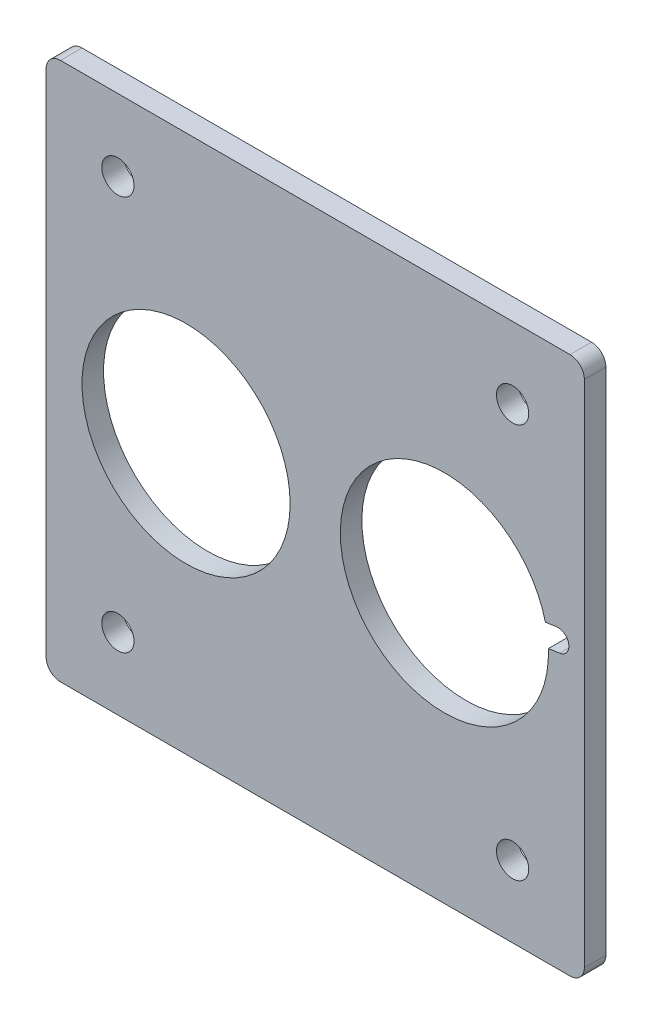
ISO-10303-21;
HEADER;
FILE_DESCRIPTION(('STEP AP214'),'2;1');
FILE_NAME('part.step','',(''),(''),'','','');
FILE_SCHEMA(('AUTOMOTIVE_DESIGN { 1 0 10303 214 1 1 1 1 }'));
ENDSEC;
DATA;
#1=APPLICATION_CONTEXT('core data for automotive mechanical design processes');
#2=APPLICATION_PROTOCOL_DEFINITION('international standard','automotive_design',2000,#1);
#3=PRODUCT_CONTEXT('',#1,'mechanical');
#4=PRODUCT('Part','Part','',(#3));
#5=PRODUCT_RELATED_PRODUCT_CATEGORY('part','',(#4));
#6=PRODUCT_DEFINITION_FORMATION('','',#4);
#7=PRODUCT_DEFINITION_CONTEXT('part definition',#1,'design');
#8=PRODUCT_DEFINITION('design','',#6,#7);
#9=PRODUCT_DEFINITION_SHAPE('','',#8);
#10=(LENGTH_UNIT() NAMED_UNIT(*) SI_UNIT(.MILLI.,.METRE.));
#11=(NAMED_UNIT(*) PLANE_ANGLE_UNIT() SI_UNIT($,.RADIAN.));
#12=(NAMED_UNIT(*) SI_UNIT($,.STERADIAN.) SOLID_ANGLE_UNIT());
#13=UNCERTAINTY_MEASURE_WITH_UNIT(LENGTH_MEASURE(1.E-05),#10,'distance_accuracy_value','');
#14=(GEOMETRIC_REPRESENTATION_CONTEXT(3) GLOBAL_UNCERTAINTY_ASSIGNED_CONTEXT((#13)) GLOBAL_UNIT_ASSIGNED_CONTEXT((#10,
#11,#12)) REPRESENTATION_CONTEXT('',''));
#15=CARTESIAN_POINT('',(0.,0.,0.));
#16=DIRECTION('',(0.,0.,1.));
#17=DIRECTION('',(1.,0.,0.));
#18=AXIS2_PLACEMENT_3D('',#15,#16,#17);
#19=CARTESIAN_POINT('',(0.,0.,3.));
#20=DIRECTION('',(0.,0.,-1.));
#21=DIRECTION('',(-1.,0.,0.));
#22=AXIS2_PLACEMENT_3D('',#19,#20,#21);
#23=PLANE('',#22);
#24=CARTESIAN_POINT('',(-27.5,-27.5,3.));
#25=DIRECTION('',(0.,0.,1.));
#26=DIRECTION('',(1.,0.,0.));
#27=AXIS2_PLACEMENT_3D('',#24,#25,#26);
#28=CIRCLE('',#27,2.25);
#29=CARTESIAN_POINT('',(-25.25,-27.5,3.));
#30=VERTEX_POINT('',#29);
#31=EDGE_CURVE('E171',#30,#30,#28,.T.);
#32=ORIENTED_EDGE('',*,*,#31,.F.);
#33=EDGE_LOOP('',(#32));
#34=FACE_BOUND('',#33,.T.);
#35=DIRECTION('',(0.,-1.,0.));
#36=VECTOR('',#35,1.);
#37=CARTESIAN_POINT('',(-37.5,-37.5,3.));
#38=LINE('',#37,#36);
#39=CARTESIAN_POINT('',(-37.5,35.5,3.));
#40=VERTEX_POINT('',#39);
#41=CARTESIAN_POINT('',(-37.5,-35.5,3.));
#42=VERTEX_POINT('',#41);
#43=EDGE_CURVE('E227',#40,#42,#38,.T.);
#44=ORIENTED_EDGE('',*,*,#43,.T.);
#45=CARTESIAN_POINT('',(-35.5,-35.5,3.));
#46=DIRECTION('',(0.,0.,-1.));
#47=DIRECTION('',(-1.,0.,0.));
#48=AXIS2_PLACEMENT_3D('',#45,#46,#47);
#49=CIRCLE('',#48,2.);
#50=CARTESIAN_POINT('',(-35.5,-37.5,3.));
#51=VERTEX_POINT('',#50);
#52=EDGE_CURVE('E284',#42,#51,#49,.F.);
#53=ORIENTED_EDGE('',*,*,#52,.T.);
#54=DIRECTION('',(1.,0.,0.));
#55=VECTOR('',#54,1.);
#56=CARTESIAN_POINT('',(-37.5,-37.5,3.));
#57=LINE('',#56,#55);
#58=CARTESIAN_POINT('',(35.5,-37.5,3.));
#59=VERTEX_POINT('',#58);
#60=EDGE_CURVE('E233',#51,#59,#57,.T.);
#61=ORIENTED_EDGE('',*,*,#60,.T.);
#62=CARTESIAN_POINT('',(35.5,-35.5,3.));
#63=DIRECTION('',(0.,0.,-1.));
#64=DIRECTION('',(-1.,0.,0.));
#65=AXIS2_PLACEMENT_3D('',#62,#63,#64);
#66=CIRCLE('',#65,2.);
#67=CARTESIAN_POINT('',(37.5,-35.5,3.));
#68=VERTEX_POINT('',#67);
#69=EDGE_CURVE('E276',#59,#68,#66,.F.);
#70=ORIENTED_EDGE('',*,*,#69,.T.);
#71=DIRECTION('',(0.,1.,0.));
#72=VECTOR('',#71,1.);
#73=CARTESIAN_POINT('',(37.5,-37.5,3.));
#74=LINE('',#73,#72);
#75=CARTESIAN_POINT('',(37.5,35.5,3.));
#76=VERTEX_POINT('',#75);
#77=EDGE_CURVE('E216',#68,#76,#74,.T.);
#78=ORIENTED_EDGE('',*,*,#77,.T.);
#79=CARTESIAN_POINT('',(35.5,35.5,3.));
#80=DIRECTION('',(0.,0.,-1.));
#81=DIRECTION('',(-1.,0.,0.));
#82=AXIS2_PLACEMENT_3D('',#79,#80,#81);
#83=CIRCLE('',#82,2.);
#84=CARTESIAN_POINT('',(35.5,37.5,3.));
#85=VERTEX_POINT('',#84);
#86=EDGE_CURVE('E274',#76,#85,#83,.F.);
#87=ORIENTED_EDGE('',*,*,#86,.T.);
#88=DIRECTION('',(-1.,0.,0.));
#89=VECTOR('',#88,1.);
#90=CARTESIAN_POINT('',(-37.5,37.5,3.));
#91=LINE('',#90,#89);
#92=CARTESIAN_POINT('',(-35.5,37.5,3.));
#93=VERTEX_POINT('',#92);
#94=EDGE_CURVE('E221',#85,#93,#91,.T.);
#95=ORIENTED_EDGE('',*,*,#94,.T.);
#96=CARTESIAN_POINT('',(-35.5,35.5,3.));
#97=DIRECTION('',(0.,0.,-1.));
#98=DIRECTION('',(-1.,0.,0.));
#99=AXIS2_PLACEMENT_3D('',#96,#97,#98);
#100=CIRCLE('',#99,2.);
#101=EDGE_CURVE('E277',#93,#40,#100,.F.);
#102=ORIENTED_EDGE('',*,*,#101,.T.);
#103=EDGE_LOOP('',(#44,#53,#61,#70,#78,#87,#95,#102));
#104=FACE_BOUND('',#103,.T.);
#105=CARTESIAN_POINT('',(-18.,0.,3.));
#106=DIRECTION('',(0.,0.,1.));
#107=DIRECTION('',(1.,0.,0.));
#108=AXIS2_PLACEMENT_3D('',#105,#106,#107);
#109=CIRCLE('',#108,14.5);
#110=CARTESIAN_POINT('',(-3.49999999999998,0.,3.));
#111=VERTEX_POINT('',#110);
#112=EDGE_CURVE('E208',#111,#111,#109,.T.);
#113=ORIENTED_EDGE('',*,*,#112,.F.);
#114=EDGE_LOOP('',(#113));
#115=FACE_BOUND('',#114,.T.);
#116=CARTESIAN_POINT('',(27.5,27.5,3.));
#117=DIRECTION('',(0.,0.,1.));
#118=DIRECTION('',(1.,0.,0.));
#119=AXIS2_PLACEMENT_3D('',#116,#117,#118);
#120=CIRCLE('',#119,2.25);
#121=CARTESIAN_POINT('',(29.75,27.5,3.));
#122=VERTEX_POINT('',#121);
#123=EDGE_CURVE('E197',#122,#122,#120,.T.);
#124=ORIENTED_EDGE('',*,*,#123,.F.);
#125=EDGE_LOOP('',(#124));
#126=FACE_BOUND('',#125,.T.);
#127=CARTESIAN_POINT('',(-27.5,27.5,3.));
#128=DIRECTION('',(0.,0.,1.));
#129=DIRECTION('',(1.,0.,0.));
#130=AXIS2_PLACEMENT_3D('',#127,#128,#129);
#131=CIRCLE('',#130,2.25);
#132=CARTESIAN_POINT('',(-25.25,27.5,3.));
#133=VERTEX_POINT('',#132);
#134=EDGE_CURVE('E189',#133,#133,#131,.T.);
#135=ORIENTED_EDGE('',*,*,#134,.F.);
#136=EDGE_LOOP('',(#135));
#137=FACE_BOUND('',#136,.T.);
#138=CARTESIAN_POINT('',(27.5,-27.5,3.));
#139=DIRECTION('',(0.,0.,1.));
#140=DIRECTION('',(1.,0.,0.));
#141=AXIS2_PLACEMENT_3D('',#138,#139,#140);
#142=CIRCLE('',#141,2.25);
#143=CARTESIAN_POINT('',(29.75,-27.5,3.));
#144=VERTEX_POINT('',#143);
#145=EDGE_CURVE('E179',#144,#144,#142,.T.);
#146=ORIENTED_EDGE('',*,*,#145,.F.);
#147=EDGE_LOOP('',(#146));
#148=FACE_BOUND('',#147,.T.);
#149=DIRECTION('',(0.990268068741571,0.139173100960063,0.));
#150=VECTOR('',#149,1.);
#151=CARTESIAN_POINT('',(17.7912403485599,1.48540210311235,3.));
#152=LINE('',#151,#150);
#153=CARTESIAN_POINT('',(32.0730895417696,3.49258510981968,3.));
#154=VERTEX_POINT('',#153);
#155=CARTESIAN_POINT('',(33.6355294484251,3.71217171847336,3.));
#156=VERTEX_POINT('',#155);
#157=EDGE_CURVE('E160',#154,#156,#152,.T.);
#158=ORIENTED_EDGE('',*,*,#157,.T.);
#159=CARTESIAN_POINT('',(33.8442890998652,2.226769615361,3.));
#160=DIRECTION('',(0.,0.,1.));
#161=DIRECTION('',(1.,0.,0.));
#162=AXIS2_PLACEMENT_3D('',#159,#160,#161);
#163=CIRCLE('',#162,1.5);
#164=CARTESIAN_POINT('',(34.0530487513052,0.741367512248641,3.));
#165=VERTEX_POINT('',#164);
#166=EDGE_CURVE('E163',#165,#156,#163,.T.);
#167=ORIENTED_EDGE('',*,*,#166,.F.);
#168=DIRECTION('',(0.990268068741571,0.139173100960062,0.));
#169=VECTOR('',#168,1.);
#170=CARTESIAN_POINT('',(18.2087596514401,-1.48540210311235,3.));
#171=LINE('',#170,#169);
#172=CARTESIAN_POINT('',(32.4906088446498,0.521780903594969,3.));
#173=VERTEX_POINT('',#172);
#174=EDGE_CURVE('E138',#173,#165,#171,.T.);
#175=ORIENTED_EDGE('',*,*,#174,.F.);
#176=CARTESIAN_POINT('',(18.,0.,3.));
#177=DIRECTION('',(0.,0.,1.));
#178=DIRECTION('',(1.,0.,0.));
#179=AXIS2_PLACEMENT_3D('',#176,#177,#178);
#180=CIRCLE('',#179,14.5);
#181=EDGE_CURVE('E202',#154,#173,#180,.T.);
#182=ORIENTED_EDGE('',*,*,#181,.F.);
#183=EDGE_LOOP('',(#158,#167,#175,#182));
#184=FACE_BOUND('',#183,.T.);
#185=ADVANCED_FACE('F43',(#34,#104,#115,#126,#137,#148,#184),#23,.F.);
#186=CARTESIAN_POINT('',(0.,0.,0.));
#187=DIRECTION('',(0.,0.,-1.));
#188=DIRECTION('',(-1.,0.,0.));
#189=AXIS2_PLACEMENT_3D('',#186,#187,#188);
#190=PLANE('',#189);
#191=DIRECTION('',(1.,0.,0.));
#192=VECTOR('',#191,1.);
#193=CARTESIAN_POINT('',(-37.5,-37.5,0.));
#194=LINE('',#193,#192);
#195=CARTESIAN_POINT('',(-35.5,-37.5,0.));
#196=VERTEX_POINT('',#195);
#197=CARTESIAN_POINT('',(35.5,-37.5,0.));
#198=VERTEX_POINT('',#197);
#199=EDGE_CURVE('E222',#196,#198,#194,.T.);
#200=ORIENTED_EDGE('',*,*,#199,.F.);
#201=CARTESIAN_POINT('',(-35.5,-35.5,0.));
#202=DIRECTION('',(0.,0.,-1.));
#203=DIRECTION('',(-1.,0.,0.));
#204=AXIS2_PLACEMENT_3D('',#201,#202,#203);
#205=CIRCLE('',#204,2.);
#206=CARTESIAN_POINT('',(-37.5,-35.5,0.));
#207=VERTEX_POINT('',#206);
#208=EDGE_CURVE('E261',#196,#207,#205,.T.);
#209=ORIENTED_EDGE('',*,*,#208,.T.);
#210=DIRECTION('',(0.,-1.,0.));
#211=VECTOR('',#210,1.);
#212=CARTESIAN_POINT('',(-37.5,-37.5,0.));
#213=LINE('',#212,#211);
#214=CARTESIAN_POINT('',(-37.5,35.5,0.));
#215=VERTEX_POINT('',#214);
#216=EDGE_CURVE('E245',#215,#207,#213,.T.);
#217=ORIENTED_EDGE('',*,*,#216,.F.);
#218=CARTESIAN_POINT('',(-35.5,35.5,0.));
#219=DIRECTION('',(0.,0.,-1.));
#220=DIRECTION('',(-1.,0.,0.));
#221=AXIS2_PLACEMENT_3D('',#218,#219,#220);
#222=CIRCLE('',#221,2.);
#223=CARTESIAN_POINT('',(-35.5,37.5,0.));
#224=VERTEX_POINT('',#223);
#225=EDGE_CURVE('E262',#215,#224,#222,.T.);
#226=ORIENTED_EDGE('',*,*,#225,.T.);
#227=DIRECTION('',(-1.,0.,0.));
#228=VECTOR('',#227,1.);
#229=CARTESIAN_POINT('',(-37.5,37.5,0.));
#230=LINE('',#229,#228);
#231=CARTESIAN_POINT('',(35.5,37.5,0.));
#232=VERTEX_POINT('',#231);
#233=EDGE_CURVE('E237',#232,#224,#230,.T.);
#234=ORIENTED_EDGE('',*,*,#233,.F.);
#235=CARTESIAN_POINT('',(35.5,35.5,0.));
#236=DIRECTION('',(0.,0.,-1.));
#237=DIRECTION('',(-1.,0.,0.));
#238=AXIS2_PLACEMENT_3D('',#235,#236,#237);
#239=CIRCLE('',#238,2.);
#240=CARTESIAN_POINT('',(37.5,35.5,0.));
#241=VERTEX_POINT('',#240);
#242=EDGE_CURVE('E253',#232,#241,#239,.T.);
#243=ORIENTED_EDGE('',*,*,#242,.T.);
#244=DIRECTION('',(0.,1.,0.));
#245=VECTOR('',#244,1.);
#246=CARTESIAN_POINT('',(37.5,-37.5,0.));
#247=LINE('',#246,#245);
#248=CARTESIAN_POINT('',(37.5,-35.5,0.));
#249=VERTEX_POINT('',#248);
#250=EDGE_CURVE('E209',#249,#241,#247,.T.);
#251=ORIENTED_EDGE('',*,*,#250,.F.);
#252=CARTESIAN_POINT('',(35.5,-35.5,0.));
#253=DIRECTION('',(0.,0.,-1.));
#254=DIRECTION('',(-1.,0.,0.));
#255=AXIS2_PLACEMENT_3D('',#252,#253,#254);
#256=CIRCLE('',#255,2.);
#257=EDGE_CURVE('E260',#249,#198,#256,.T.);
#258=ORIENTED_EDGE('',*,*,#257,.T.);
#259=EDGE_LOOP('',(#200,#209,#217,#226,#234,#243,#251,#258));
#260=FACE_BOUND('',#259,.T.);
#261=CARTESIAN_POINT('',(-18.,0.,0.));
#262=DIRECTION('',(0.,0.,1.));
#263=DIRECTION('',(1.,0.,0.));
#264=AXIS2_PLACEMENT_3D('',#261,#262,#263);
#265=CIRCLE('',#264,14.5);
#266=CARTESIAN_POINT('',(-3.49999999999998,0.,0.));
#267=VERTEX_POINT('',#266);
#268=EDGE_CURVE('E204',#267,#267,#265,.T.);
#269=ORIENTED_EDGE('',*,*,#268,.T.);
#270=EDGE_LOOP('',(#269));
#271=FACE_BOUND('',#270,.T.);
#272=CARTESIAN_POINT('',(27.5,27.5,0.));
#273=DIRECTION('',(0.,0.,1.));
#274=DIRECTION('',(1.,0.,0.));
#275=AXIS2_PLACEMENT_3D('',#272,#273,#274);
#276=CIRCLE('',#275,2.25);
#277=CARTESIAN_POINT('',(29.75,27.5,0.));
#278=VERTEX_POINT('',#277);
#279=EDGE_CURVE('E198',#278,#278,#276,.T.);
#280=ORIENTED_EDGE('',*,*,#279,.T.);
#281=EDGE_LOOP('',(#280));
#282=FACE_BOUND('',#281,.T.);
#283=CARTESIAN_POINT('',(-27.5,27.5,0.));
#284=DIRECTION('',(0.,0.,1.));
#285=DIRECTION('',(1.,0.,0.));
#286=AXIS2_PLACEMENT_3D('',#283,#284,#285);
#287=CIRCLE('',#286,2.25);
#288=CARTESIAN_POINT('',(-25.25,27.5,0.));
#289=VERTEX_POINT('',#288);
#290=EDGE_CURVE('E191',#289,#289,#287,.T.);
#291=ORIENTED_EDGE('',*,*,#290,.T.);
#292=EDGE_LOOP('',(#291));
#293=FACE_BOUND('',#292,.T.);
#294=CARTESIAN_POINT('',(27.5,-27.5,0.));
#295=DIRECTION('',(0.,0.,1.));
#296=DIRECTION('',(1.,0.,0.));
#297=AXIS2_PLACEMENT_3D('',#294,#295,#296);
#298=CIRCLE('',#297,2.25);
#299=CARTESIAN_POINT('',(29.75,-27.5,0.));
#300=VERTEX_POINT('',#299);
#301=EDGE_CURVE('E183',#300,#300,#298,.T.);
#302=ORIENTED_EDGE('',*,*,#301,.T.);
#303=EDGE_LOOP('',(#302));
#304=FACE_BOUND('',#303,.T.);
#305=CARTESIAN_POINT('',(-27.5,-27.5,0.));
#306=DIRECTION('',(0.,0.,1.));
#307=DIRECTION('',(1.,0.,0.));
#308=AXIS2_PLACEMENT_3D('',#305,#306,#307);
#309=CIRCLE('',#308,2.25);
#310=CARTESIAN_POINT('',(-25.25,-27.5,0.));
#311=VERTEX_POINT('',#310);
#312=EDGE_CURVE('E176',#311,#311,#309,.T.);
#313=ORIENTED_EDGE('',*,*,#312,.T.);
#314=EDGE_LOOP('',(#313));
#315=FACE_BOUND('',#314,.T.);
#316=CARTESIAN_POINT('',(33.8442890998652,2.226769615361,0.));
#317=DIRECTION('',(0.,0.,1.));
#318=DIRECTION('',(1.,0.,0.));
#319=AXIS2_PLACEMENT_3D('',#316,#317,#318);
#320=CIRCLE('',#319,1.5);
#321=CARTESIAN_POINT('',(34.0530487513052,0.741367512248641,0.));
#322=VERTEX_POINT('',#321);
#323=CARTESIAN_POINT('',(33.6355294484251,3.71217171847336,0.));
#324=VERTEX_POINT('',#323);
#325=EDGE_CURVE('E149',#322,#324,#320,.T.);
#326=ORIENTED_EDGE('',*,*,#325,.T.);
#327=DIRECTION('',(0.990268068741571,0.139173100960063,0.));
#328=VECTOR('',#327,1.);
#329=CARTESIAN_POINT('',(17.7912403485599,1.48540210311235,0.));
#330=LINE('',#329,#328);
#331=CARTESIAN_POINT('',(32.0730895417696,3.49258510981968,0.));
#332=VERTEX_POINT('',#331);
#333=EDGE_CURVE('E145',#332,#324,#330,.T.);
#334=ORIENTED_EDGE('',*,*,#333,.F.);
#335=CARTESIAN_POINT('',(18.,0.,0.));
#336=DIRECTION('',(0.,0.,1.));
#337=DIRECTION('',(1.,0.,0.));
#338=AXIS2_PLACEMENT_3D('',#335,#336,#337);
#339=CIRCLE('',#338,14.5);
#340=CARTESIAN_POINT('',(32.4906088446498,0.521780903594969,0.));
#341=VERTEX_POINT('',#340);
#342=EDGE_CURVE('E153',#332,#341,#339,.T.);
#343=ORIENTED_EDGE('',*,*,#342,.T.);
#344=DIRECTION('',(0.990268068741571,0.139173100960062,0.));
#345=VECTOR('',#344,1.);
#346=CARTESIAN_POINT('',(18.2087596514401,-1.48540210311235,0.));
#347=LINE('',#346,#345);
#348=EDGE_CURVE('E56',#341,#322,#347,.T.);
#349=ORIENTED_EDGE('',*,*,#348,.T.);
#350=EDGE_LOOP('',(#326,#334,#343,#349));
#351=FACE_BOUND('',#350,.T.);
#352=ADVANCED_FACE('F154',(#260,#271,#282,#293,#304,#315,#351),#190,.T.);
#353=CARTESIAN_POINT('',(18.,0.,0.));
#354=DIRECTION('',(0.,0.,1.));
#355=DIRECTION('',(1.,0.,0.));
#356=AXIS2_PLACEMENT_3D('',#353,#354,#355);
#357=CYLINDRICAL_SURFACE('',#356,14.5);
#358=DIRECTION('',(0.,0.,1.));
#359=VECTOR('',#358,1.);
#360=CARTESIAN_POINT('',(32.0730895417696,3.49258510981968,0.));
#361=LINE('',#360,#359);
#362=EDGE_CURVE('E11',#154,#332,#361,.F.);
#363=ORIENTED_EDGE('',*,*,#362,.F.);
#364=ORIENTED_EDGE('',*,*,#181,.T.);
#365=DIRECTION('',(0.,0.,1.));
#366=VECTOR('',#365,1.);
#367=CARTESIAN_POINT('',(32.4906088446498,0.521780903594969,0.));
#368=LINE('',#367,#366);
#369=EDGE_CURVE('E55',#173,#341,#368,.F.);
#370=ORIENTED_EDGE('',*,*,#369,.T.);
#371=ORIENTED_EDGE('',*,*,#342,.F.);
#372=EDGE_LOOP('',(#363,#364,#370,#371));
#373=FACE_BOUND('',#372,.T.);
#374=ADVANCED_FACE('F301',(#373),#357,.F.);
#375=CARTESIAN_POINT('',(37.5,-37.5,3.));
#376=DIRECTION('',(-1.,0.,0.));
#377=DIRECTION('',(0.,0.,1.));
#378=AXIS2_PLACEMENT_3D('',#375,#376,#377);
#379=PLANE('',#378);
#380=ORIENTED_EDGE('',*,*,#77,.F.);
#381=DIRECTION('',(0.,0.,-1.));
#382=VECTOR('',#381,1.);
#383=CARTESIAN_POINT('',(37.5,-35.5,3.));
#384=LINE('',#383,#382);
#385=EDGE_CURVE('E294',#68,#249,#384,.T.);
#386=ORIENTED_EDGE('',*,*,#385,.T.);
#387=ORIENTED_EDGE('',*,*,#250,.T.);
#388=DIRECTION('',(0.,0.,-1.));
#389=VECTOR('',#388,1.);
#390=CARTESIAN_POINT('',(37.5,35.5,3.));
#391=LINE('',#390,#389);
#392=EDGE_CURVE('E292',#241,#76,#391,.F.);
#393=ORIENTED_EDGE('',*,*,#392,.T.);
#394=EDGE_LOOP('',(#380,#386,#387,#393));
#395=FACE_BOUND('',#394,.T.);
#396=ADVANCED_FACE('F343',(#395),#379,.F.);
#397=CARTESIAN_POINT('',(-37.5,37.5,3.));
#398=DIRECTION('',(0.,-1.,0.));
#399=DIRECTION('',(0.,0.,-1.));
#400=AXIS2_PLACEMENT_3D('',#397,#398,#399);
#401=PLANE('',#400);
#402=ORIENTED_EDGE('',*,*,#233,.T.);
#403=DIRECTION('',(0.,0.,-1.));
#404=VECTOR('',#403,1.);
#405=CARTESIAN_POINT('',(-35.5,37.5,3.));
#406=LINE('',#405,#404);
#407=EDGE_CURVE('E70',#224,#93,#406,.F.);
#408=ORIENTED_EDGE('',*,*,#407,.T.);
#409=ORIENTED_EDGE('',*,*,#94,.F.);
#410=DIRECTION('',(0.,0.,-1.));
#411=VECTOR('',#410,1.);
#412=CARTESIAN_POINT('',(35.5,37.5,3.));
#413=LINE('',#412,#411);
#414=EDGE_CURVE('E288',#85,#232,#413,.T.);
#415=ORIENTED_EDGE('',*,*,#414,.T.);
#416=EDGE_LOOP('',(#402,#408,#409,#415));
#417=FACE_BOUND('',#416,.T.);
#418=ADVANCED_FACE('F338',(#417),#401,.F.);
#419=CARTESIAN_POINT('',(-37.5,-37.5,3.));
#420=DIRECTION('',(1.,0.,0.));
#421=DIRECTION('',(0.,0.,-1.));
#422=AXIS2_PLACEMENT_3D('',#419,#420,#421);
#423=PLANE('',#422);
#424=ORIENTED_EDGE('',*,*,#216,.T.);
#425=DIRECTION('',(0.,0.,-1.));
#426=VECTOR('',#425,1.);
#427=CARTESIAN_POINT('',(-37.5,-35.5,3.));
#428=LINE('',#427,#426);
#429=EDGE_CURVE('E272',#207,#42,#428,.F.);
#430=ORIENTED_EDGE('',*,*,#429,.T.);
#431=ORIENTED_EDGE('',*,*,#43,.F.);
#432=DIRECTION('',(0.,0.,-1.));
#433=VECTOR('',#432,1.);
#434=CARTESIAN_POINT('',(-37.5,35.5,3.));
#435=LINE('',#434,#433);
#436=EDGE_CURVE('E270',#40,#215,#435,.T.);
#437=ORIENTED_EDGE('',*,*,#436,.T.);
#438=EDGE_LOOP('',(#424,#430,#431,#437));
#439=FACE_BOUND('',#438,.T.);
#440=ADVANCED_FACE('F337',(#439),#423,.F.);
#441=CARTESIAN_POINT('',(-37.5,-37.5,3.));
#442=DIRECTION('',(0.,1.,0.));
#443=DIRECTION('',(0.,0.,1.));
#444=AXIS2_PLACEMENT_3D('',#441,#442,#443);
#445=PLANE('',#444);
#446=ORIENTED_EDGE('',*,*,#60,.F.);
#447=DIRECTION('',(0.,0.,-1.));
#448=VECTOR('',#447,1.);
#449=CARTESIAN_POINT('',(-35.5,-37.5,3.));
#450=LINE('',#449,#448);
#451=EDGE_CURVE('E252',#51,#196,#450,.T.);
#452=ORIENTED_EDGE('',*,*,#451,.T.);
#453=ORIENTED_EDGE('',*,*,#199,.T.);
#454=DIRECTION('',(0.,0.,-1.));
#455=VECTOR('',#454,1.);
#456=CARTESIAN_POINT('',(35.5,-37.5,3.));
#457=LINE('',#456,#455);
#458=EDGE_CURVE('E232',#198,#59,#457,.F.);
#459=ORIENTED_EDGE('',*,*,#458,.T.);
#460=EDGE_LOOP('',(#446,#452,#453,#459));
#461=FACE_BOUND('',#460,.T.);
#462=ADVANCED_FACE('F335',(#461),#445,.F.);
#463=CARTESIAN_POINT('',(-18.,0.,0.));
#464=DIRECTION('',(0.,0.,1.));
#465=DIRECTION('',(1.,0.,0.));
#466=AXIS2_PLACEMENT_3D('',#463,#464,#465);
#467=CYLINDRICAL_SURFACE('',#466,14.5);
#468=ORIENTED_EDGE('',*,*,#268,.F.);
#469=EDGE_LOOP('',(#468));
#470=FACE_BOUND('',#469,.T.);
#471=ORIENTED_EDGE('',*,*,#112,.T.);
#472=EDGE_LOOP('',(#471));
#473=FACE_BOUND('',#472,.T.);
#474=ADVANCED_FACE('F334',(#470,#473),#467,.F.);
#475=CARTESIAN_POINT('',(-35.5,-35.5,3.));
#476=DIRECTION('',(0.,0.,-1.));
#477=DIRECTION('',(-1.,0.,0.));
#478=AXIS2_PLACEMENT_3D('',#475,#476,#477);
#479=CYLINDRICAL_SURFACE('',#478,2.);
#480=ORIENTED_EDGE('',*,*,#52,.F.);
#481=ORIENTED_EDGE('',*,*,#429,.F.);
#482=ORIENTED_EDGE('',*,*,#208,.F.);
#483=ORIENTED_EDGE('',*,*,#451,.F.);
#484=EDGE_LOOP('',(#480,#481,#482,#483));
#485=FACE_BOUND('',#484,.T.);
#486=ADVANCED_FACE('F349',(#485),#479,.T.);
#487=CARTESIAN_POINT('',(-35.5,35.5,3.));
#488=DIRECTION('',(0.,0.,-1.));
#489=DIRECTION('',(-1.,0.,0.));
#490=AXIS2_PLACEMENT_3D('',#487,#488,#489);
#491=CYLINDRICAL_SURFACE('',#490,2.);
#492=ORIENTED_EDGE('',*,*,#101,.F.);
#493=ORIENTED_EDGE('',*,*,#407,.F.);
#494=ORIENTED_EDGE('',*,*,#225,.F.);
#495=ORIENTED_EDGE('',*,*,#436,.F.);
#496=EDGE_LOOP('',(#492,#493,#494,#495));
#497=FACE_BOUND('',#496,.T.);
#498=ADVANCED_FACE('F353',(#497),#491,.T.);
#499=CARTESIAN_POINT('',(35.5,-35.5,3.));
#500=DIRECTION('',(0.,0.,-1.));
#501=DIRECTION('',(-1.,0.,0.));
#502=AXIS2_PLACEMENT_3D('',#499,#500,#501);
#503=CYLINDRICAL_SURFACE('',#502,2.);
#504=ORIENTED_EDGE('',*,*,#69,.F.);
#505=ORIENTED_EDGE('',*,*,#458,.F.);
#506=ORIENTED_EDGE('',*,*,#257,.F.);
#507=ORIENTED_EDGE('',*,*,#385,.F.);
#508=EDGE_LOOP('',(#504,#505,#506,#507));
#509=FACE_BOUND('',#508,.T.);
#510=ADVANCED_FACE('F352',(#509),#503,.T.);
#511=CARTESIAN_POINT('',(35.5,35.5,3.));
#512=DIRECTION('',(0.,0.,-1.));
#513=DIRECTION('',(-1.,0.,0.));
#514=AXIS2_PLACEMENT_3D('',#511,#512,#513);
#515=CYLINDRICAL_SURFACE('',#514,2.);
#516=ORIENTED_EDGE('',*,*,#86,.F.);
#517=ORIENTED_EDGE('',*,*,#392,.F.);
#518=ORIENTED_EDGE('',*,*,#242,.F.);
#519=ORIENTED_EDGE('',*,*,#414,.F.);
#520=EDGE_LOOP('',(#516,#517,#518,#519));
#521=FACE_BOUND('',#520,.T.);
#522=ADVANCED_FACE('F44',(#521),#515,.T.);
#523=CARTESIAN_POINT('',(27.5,27.5,3.));
#524=DIRECTION('',(0.,0.,1.));
#525=DIRECTION('',(1.,0.,0.));
#526=AXIS2_PLACEMENT_3D('',#523,#524,#525);
#527=CYLINDRICAL_SURFACE('',#526,2.25);
#528=ORIENTED_EDGE('',*,*,#279,.F.);
#529=EDGE_LOOP('',(#528));
#530=FACE_BOUND('',#529,.T.);
#531=ORIENTED_EDGE('',*,*,#123,.T.);
#532=EDGE_LOOP('',(#531));
#533=FACE_BOUND('',#532,.T.);
#534=ADVANCED_FACE('F363',(#530,#533),#527,.F.);
#535=CARTESIAN_POINT('',(-27.5,27.5,3.));
#536=DIRECTION('',(0.,0.,1.));
#537=DIRECTION('',(1.,0.,0.));
#538=AXIS2_PLACEMENT_3D('',#535,#536,#537);
#539=CYLINDRICAL_SURFACE('',#538,2.25);
#540=ORIENTED_EDGE('',*,*,#290,.F.);
#541=EDGE_LOOP('',(#540));
#542=FACE_BOUND('',#541,.T.);
#543=ORIENTED_EDGE('',*,*,#134,.T.);
#544=EDGE_LOOP('',(#543));
#545=FACE_BOUND('',#544,.T.);
#546=ADVANCED_FACE('F398',(#542,#545),#539,.F.);
#547=CARTESIAN_POINT('',(27.5,-27.5,3.));
#548=DIRECTION('',(0.,0.,1.));
#549=DIRECTION('',(1.,0.,0.));
#550=AXIS2_PLACEMENT_3D('',#547,#548,#549);
#551=CYLINDRICAL_SURFACE('',#550,2.25);
#552=ORIENTED_EDGE('',*,*,#301,.F.);
#553=EDGE_LOOP('',(#552));
#554=FACE_BOUND('',#553,.T.);
#555=ORIENTED_EDGE('',*,*,#145,.T.);
#556=EDGE_LOOP('',(#555));
#557=FACE_BOUND('',#556,.T.);
#558=ADVANCED_FACE('F314',(#554,#557),#551,.F.);
#559=CARTESIAN_POINT('',(-27.5,-27.5,3.));
#560=DIRECTION('',(0.,0.,1.));
#561=DIRECTION('',(1.,0.,0.));
#562=AXIS2_PLACEMENT_3D('',#559,#560,#561);
#563=CYLINDRICAL_SURFACE('',#562,2.25);
#564=ORIENTED_EDGE('',*,*,#312,.F.);
#565=EDGE_LOOP('',(#564));
#566=FACE_BOUND('',#565,.T.);
#567=ORIENTED_EDGE('',*,*,#31,.T.);
#568=EDGE_LOOP('',(#567));
#569=FACE_BOUND('',#568,.T.);
#570=ADVANCED_FACE('F310',(#566,#569),#563,.F.);
#571=CARTESIAN_POINT('',(17.7912403485599,1.48540210311235,0.));
#572=DIRECTION('',(0.139173100960063,-0.990268068741571,0.));
#573=DIRECTION('',(0.990268068741571,0.139173100960063,0.));
#574=AXIS2_PLACEMENT_3D('',#571,#572,#573);
#575=PLANE('',#574);
#576=ORIENTED_EDGE('',*,*,#362,.T.);
#577=ORIENTED_EDGE('',*,*,#333,.T.);
#578=DIRECTION('',(0.,0.,1.));
#579=VECTOR('',#578,1.);
#580=CARTESIAN_POINT('',(33.6355294484251,3.71217171847336,0.));
#581=LINE('',#580,#579);
#582=EDGE_CURVE('E142',#324,#156,#581,.T.);
#583=ORIENTED_EDGE('',*,*,#582,.T.);
#584=ORIENTED_EDGE('',*,*,#157,.F.);
#585=EDGE_LOOP('',(#576,#577,#583,#584));
#586=FACE_BOUND('',#585,.T.);
#587=ADVANCED_FACE('F304',(#586),#575,.T.);
#588=CARTESIAN_POINT('',(18.2087596514401,-1.48540210311235,0.));
#589=DIRECTION('',(0.139173100960062,-0.990268068741571,0.));
#590=DIRECTION('',(0.990268068741571,0.139173100960062,0.));
#591=AXIS2_PLACEMENT_3D('',#588,#589,#590);
#592=PLANE('',#591);
#593=ORIENTED_EDGE('',*,*,#174,.T.);
#594=DIRECTION('',(0.,0.,1.));
#595=VECTOR('',#594,1.);
#596=CARTESIAN_POINT('',(34.0530487513052,0.741367512248641,0.));
#597=LINE('',#596,#595);
#598=EDGE_CURVE('E135',#322,#165,#597,.T.);
#599=ORIENTED_EDGE('',*,*,#598,.F.);
#600=ORIENTED_EDGE('',*,*,#348,.F.);
#601=ORIENTED_EDGE('',*,*,#369,.F.);
#602=EDGE_LOOP('',(#593,#599,#600,#601));
#603=FACE_BOUND('',#602,.T.);
#604=ADVANCED_FACE('F131',(#603),#592,.F.);
#605=CARTESIAN_POINT('',(33.8442890998652,2.226769615361,0.));
#606=DIRECTION('',(0.,0.,1.));
#607=DIRECTION('',(1.,0.,0.));
#608=AXIS2_PLACEMENT_3D('',#605,#606,#607);
#609=CYLINDRICAL_SURFACE('',#608,1.5);
#610=ORIENTED_EDGE('',*,*,#166,.T.);
#611=ORIENTED_EDGE('',*,*,#582,.F.);
#612=ORIENTED_EDGE('',*,*,#325,.F.);
#613=ORIENTED_EDGE('',*,*,#598,.T.);
#614=EDGE_LOOP('',(#610,#611,#612,#613));
#615=FACE_BOUND('',#614,.T.);
#616=ADVANCED_FACE('F146',(#615),#609,.F.);
#617=CLOSED_SHELL('',(#185,#352,#374,#396,#418,#440,#462,#474,#486,#498,#510,#522,#534,#546,
#558,#570,#587,#604,#616));
#618=MANIFOLD_SOLID_BREP('B2',#617);
#619=ADVANCED_BREP_SHAPE_REPRESENTATION('',(#18,#618),#14);
#620=SHAPE_DEFINITION_REPRESENTATION(#9,#619);
ENDSEC;
END-ISO-10303-21;
